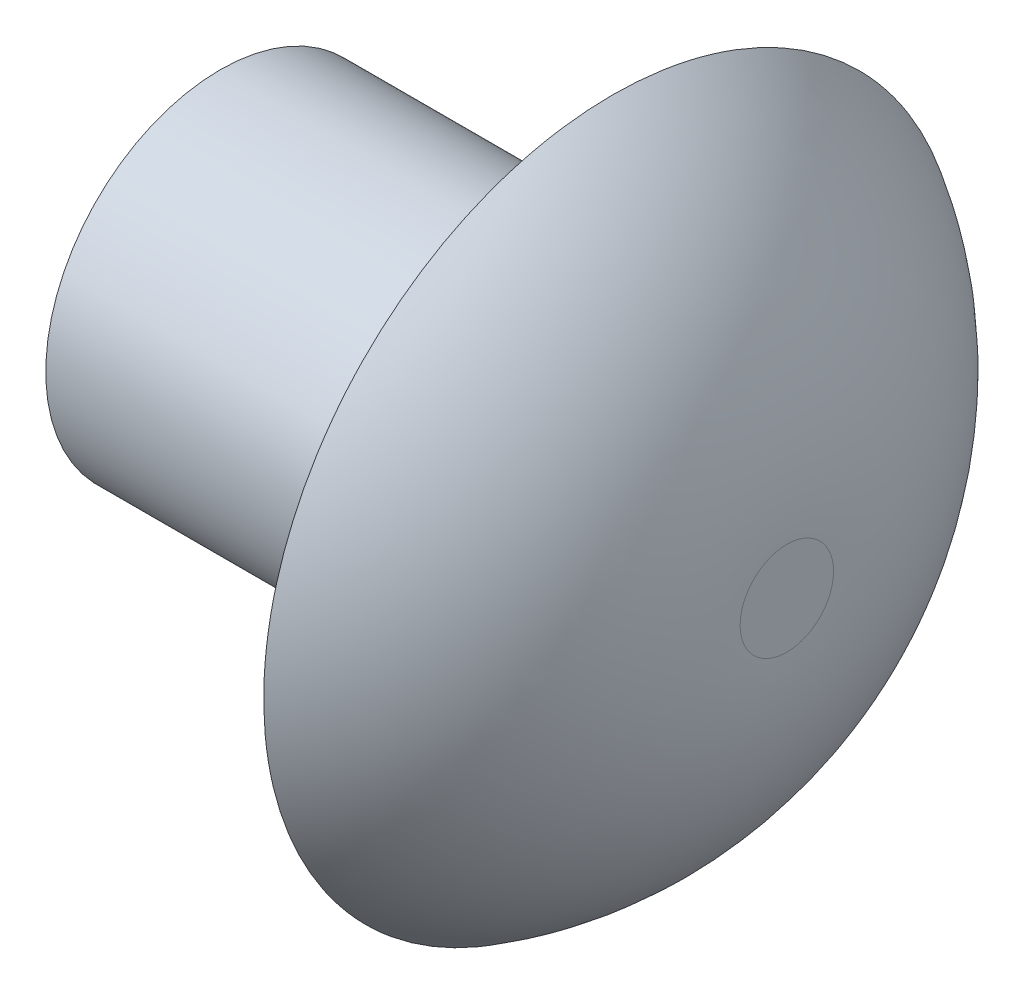
ISO-10303-21;
HEADER;
FILE_DESCRIPTION(('STEP AP214'),'2;1');
FILE_NAME('part.step','',(''),(''),'','','');
FILE_SCHEMA(('AUTOMOTIVE_DESIGN { 1 0 10303 214 1 1 1 1 }'));
ENDSEC;
DATA;
#1=APPLICATION_CONTEXT('core data for automotive mechanical design processes');
#2=APPLICATION_PROTOCOL_DEFINITION('international standard','automotive_design',2000,#1);
#3=PRODUCT_CONTEXT('',#1,'mechanical');
#4=PRODUCT('Part','Part','',(#3));
#5=PRODUCT_RELATED_PRODUCT_CATEGORY('part','',(#4));
#6=PRODUCT_DEFINITION_FORMATION('','',#4);
#7=PRODUCT_DEFINITION_CONTEXT('part definition',#1,'design');
#8=PRODUCT_DEFINITION('design','',#6,#7);
#9=PRODUCT_DEFINITION_SHAPE('','',#8);
#10=(LENGTH_UNIT() NAMED_UNIT(*) SI_UNIT(.MILLI.,.METRE.));
#11=(NAMED_UNIT(*) PLANE_ANGLE_UNIT() SI_UNIT($,.RADIAN.));
#12=(NAMED_UNIT(*) SI_UNIT($,.STERADIAN.) SOLID_ANGLE_UNIT());
#13=UNCERTAINTY_MEASURE_WITH_UNIT(LENGTH_MEASURE(1.E-05),#10,'distance_accuracy_value','');
#14=(GEOMETRIC_REPRESENTATION_CONTEXT(3) GLOBAL_UNCERTAINTY_ASSIGNED_CONTEXT((#13)) GLOBAL_UNIT_ASSIGNED_CONTEXT((#10,
#11,#12)) REPRESENTATION_CONTEXT('',''));
#15=CARTESIAN_POINT('',(0.,0.,0.));
#16=DIRECTION('',(0.,0.,1.));
#17=DIRECTION('',(1.,0.,0.));
#18=AXIS2_PLACEMENT_3D('',#15,#16,#17);
#19=CARTESIAN_POINT('',(10.0000000000003,-12.4389340062399,-16.2330190772817));
#20=DIRECTION('',(-1.,0.,0.));
#21=DIRECTION('',(0.,1.,0.));
#22=AXIS2_PLACEMENT_3D('',#19,#20,#21);
#23=CYLINDRICAL_SURFACE('',#22,2.);
#24=CARTESIAN_POINT('',(7.00000000000026,-12.4389340062399,-16.2330190772817));
#25=DIRECTION('',(-1.,0.,0.));
#26=DIRECTION('',(0.,1.,0.));
#27=AXIS2_PLACEMENT_3D('',#24,#25,#26);
#28=CIRCLE('',#27,2.);
#29=CARTESIAN_POINT('',(7.00000000000026,-14.4389340062399,-16.2330190772817));
#30=VERTEX_POINT('',#29);
#31=EDGE_CURVE('E71',#30,#30,#28,.T.);
#32=ORIENTED_EDGE('',*,*,#31,.F.);
#33=DIRECTION('',(1.,0.,0.));
#34=VECTOR('',#33,1.);
#35=CARTESIAN_POINT('',(10.0000000000003,-14.4389340062399,-16.2330190772817));
#36=LINE('',#35,#34);
#37=CARTESIAN_POINT('',(11.5000000000003,-14.4389340062399,-16.2330190772817));
#38=VERTEX_POINT('',#37);
#39=EDGE_CURVE('E11',#30,#38,#36,.T.);
#40=ORIENTED_EDGE('',*,*,#39,.T.);
#41=CARTESIAN_POINT('',(11.5000000000003,-12.4389340062399,-16.2330190772817));
#42=DIRECTION('',(-1.,0.,0.));
#43=DIRECTION('',(0.,1.,0.));
#44=AXIS2_PLACEMENT_3D('',#41,#42,#43);
#45=CIRCLE('',#44,2.);
#46=EDGE_CURVE('E51',#38,#38,#45,.T.);
#47=ORIENTED_EDGE('',*,*,#46,.T.);
#48=ORIENTED_EDGE('',*,*,#39,.F.);
#49=EDGE_LOOP('',(#32,#40,#47,#48));
#50=FACE_BOUND('',#49,.T.);
#51=ADVANCED_FACE('F41',(#50),#23,.T.);
#52=CARTESIAN_POINT('',(11.5000000000003,-12.4389340062399,-16.2330190772817));
#53=DIRECTION('',(1.,0.,0.));
#54=DIRECTION('',(0.,0.,1.));
#55=AXIS2_PLACEMENT_3D('',#52,#53,#54);
#56=PLANE('',#55);
#57=ORIENTED_EDGE('',*,*,#46,.F.);
#58=EDGE_LOOP('',(#57));
#59=FACE_BOUND('',#58,.T.);
#60=CARTESIAN_POINT('',(11.5000000000003,-12.4389340062399,-16.2330190772817));
#61=DIRECTION('',(-1.,0.,0.));
#62=DIRECTION('',(0.,1.,0.));
#63=AXIS2_PLACEMENT_3D('',#60,#61,#62);
#64=CIRCLE('',#63,4.);
#65=CARTESIAN_POINT('',(11.5000000000003,-8.4389340062399,-16.2330190772817));
#66=VERTEX_POINT('',#65);
#67=EDGE_CURVE('E80',#66,#66,#64,.T.);
#68=ORIENTED_EDGE('',*,*,#67,.T.);
#69=EDGE_LOOP('',(#68));
#70=FACE_BOUND('',#69,.T.);
#71=ADVANCED_FACE('F43',(#59,#70),#56,.F.);
#72=CARTESIAN_POINT('',(13.5000000000003,-12.4389340062399,-16.2330190772817));
#73=DIRECTION('',(1.,0.,0.));
#74=DIRECTION('',(0.,0.,1.));
#75=AXIS2_PLACEMENT_3D('',#72,#73,#74);
#76=PLANE('',#75);
#77=CARTESIAN_POINT('',(13.5000000000003,-12.4389340062399,-16.2330190772817));
#78=DIRECTION('',(1.,0.,0.));
#79=DIRECTION('',(0.,-1.,0.));
#80=AXIS2_PLACEMENT_3D('',#77,#78,#79);
#81=CIRCLE('',#80,0.535898384862246);
#82=CARTESIAN_POINT('',(13.5000000000003,-11.9030356213777,-16.2330190772817));
#83=VERTEX_POINT('',#82);
#84=EDGE_CURVE('E45',#83,#83,#81,.T.);
#85=ORIENTED_EDGE('',*,*,#84,.T.);
#86=EDGE_LOOP('',(#85));
#87=FACE_BOUND('',#86,.T.);
#88=ADVANCED_FACE('F93',(#87),#76,.T.);
#89=CARTESIAN_POINT('',(11.5000000000003,-8.4389340062399,-16.2330190772817));
#90=CARTESIAN_POINT('',(11.5000000000003,-8.43893400623991,-12.2330190772817));
#91=CARTESIAN_POINT('',(11.5000000000003,-12.4389340062399,-12.2330190772817));
#92=CARTESIAN_POINT('',(11.5000000000003,-16.4389340062399,-12.2330190772817));
#93=CARTESIAN_POINT('',(11.5000000000003,-16.4389340062399,-16.2330190772817));
#94=CARTESIAN_POINT('',(11.5000000000003,-16.4389340062399,-20.2330190772817));
#95=CARTESIAN_POINT('',(11.5000000000003,-12.4389340062399,-20.2330190772817));
#96=CARTESIAN_POINT('',(11.5000000000003,-8.43893400623991,-20.2330190772817));
#97=CARTESIAN_POINT('',(11.5000000000003,-8.4389340062399,-16.2330190772817));
#98=CARTESIAN_POINT('',(13.5000000000003,-9.59363454461916,-16.2330190772817));
#99=CARTESIAN_POINT('',(13.5000000000003,-9.59363454461917,-13.387719615661));
#100=CARTESIAN_POINT('',(13.5000000000003,-12.4389340062399,-13.387719615661));
#101=CARTESIAN_POINT('',(13.5000000000003,-15.2842334678607,-13.387719615661));
#102=CARTESIAN_POINT('',(13.5000000000003,-15.2842334678607,-16.2330190772817));
#103=CARTESIAN_POINT('',(13.5000000000003,-15.2842334678607,-19.0783185389024));
#104=CARTESIAN_POINT('',(13.5000000000003,-12.4389340062399,-19.0783185389024));
#105=CARTESIAN_POINT('',(13.5000000000003,-9.59363454461917,-19.0783185389024));
#106=CARTESIAN_POINT('',(13.5000000000003,-9.59363454461916,-16.2330190772817));
#107=CARTESIAN_POINT('',(13.5000000000003,-11.9030356213777,-16.2330190772817));
#108=CARTESIAN_POINT('',(13.5000000000003,-11.9030356213777,-15.6971206924195));
#109=CARTESIAN_POINT('',(13.5000000000003,-12.4389340062399,-15.6971206924195));
#110=CARTESIAN_POINT('',(13.5000000000003,-12.9748323911021,-15.6971206924195));
#111=CARTESIAN_POINT('',(13.5000000000003,-12.9748323911021,-16.2330190772817));
#112=CARTESIAN_POINT('',(13.5000000000003,-12.9748323911021,-16.7689174621439));
#113=CARTESIAN_POINT('',(13.5000000000003,-12.4389340062399,-16.7689174621439));
#114=CARTESIAN_POINT('',(13.5000000000003,-11.9030356213777,-16.7689174621439));
#115=CARTESIAN_POINT('',(13.5000000000003,-11.9030356213777,-16.2330190772817));
#116=(BOUNDED_SURFACE() B_SPLINE_SURFACE(2,2,((#89,#90,#91,#92,#93,#94,#95,#96,#97),(#98,#99,
#100,#101,#102,#103,#104,#105,#106),(#107,#108,#109,#110,#111,#112,#113,#114,#115)),
.UNSPECIFIED.,.F.,.T.,.F.) B_SPLINE_SURFACE_WITH_KNOTS((3,3),(3,2,2,2,3),(0.523598775598299,
1.5707963267949),(-3.14159265358979,-1.5707963267949,0.,1.5707963267949,3.14159265358979),
.UNSPECIFIED.) GEOMETRIC_REPRESENTATION_ITEM() RATIONAL_B_SPLINE_SURFACE(((1.,0.707106781186548,
1.,0.707106781186548,1.,0.707106781186548,1.,0.707106781186548,1.),(0.866025403784439,
0.612372435695795,0.866025403784439,0.612372435695795,0.866025403784439,0.612372435695795,
0.866025403784439,0.612372435695795,0.866025403784439),(1.,0.707106781186548,1.,
0.707106781186548,1.,0.707106781186548,1.,0.707106781186548,1.))) REPRESENTATION_ITEM('') SURFACE());
#117=CARTESIAN_POINT('',(9.50000000000026,-11.9030356213777,-16.2330190772817));
#118=DIRECTION('',(0.,0.,1.));
#119=DIRECTION('',(0.,1.,0.));
#120=AXIS2_PLACEMENT_3D('',#117,#118,#119);
#121=CIRCLE('',#120,4.);
#122=EDGE_CURVE('E65',#83,#66,#121,.T.);
#123=ORIENTED_EDGE('',*,*,#84,.F.);
#124=ORIENTED_EDGE('',*,*,#122,.T.);
#125=ORIENTED_EDGE('',*,*,#67,.F.);
#126=ORIENTED_EDGE('',*,*,#122,.F.);
#127=EDGE_LOOP('',(#123,#124,#125,#126));
#128=FACE_BOUND('',#127,.T.);
#129=ADVANCED_FACE('F91',(#128),#116,.F.);
#130=CARTESIAN_POINT('',(7.00000000000026,-12.4389340062399,-16.2330190772817));
#131=DIRECTION('',(1.,0.,0.));
#132=DIRECTION('',(0.,0.,1.));
#133=AXIS2_PLACEMENT_3D('',#130,#131,#132);
#134=PLANE('',#133);
#135=ORIENTED_EDGE('',*,*,#31,.T.);
#136=EDGE_LOOP('',(#135));
#137=FACE_BOUND('',#136,.T.);
#138=ADVANCED_FACE('F73',(#137),#134,.F.);
#139=CLOSED_SHELL('',(#51,#71,#88,#129,#138));
#140=MANIFOLD_SOLID_BREP('B2',#139);
#141=ADVANCED_BREP_SHAPE_REPRESENTATION('',(#18,#140),#14);
#142=SHAPE_DEFINITION_REPRESENTATION(#9,#141);
ENDSEC;
END-ISO-10303-21;
